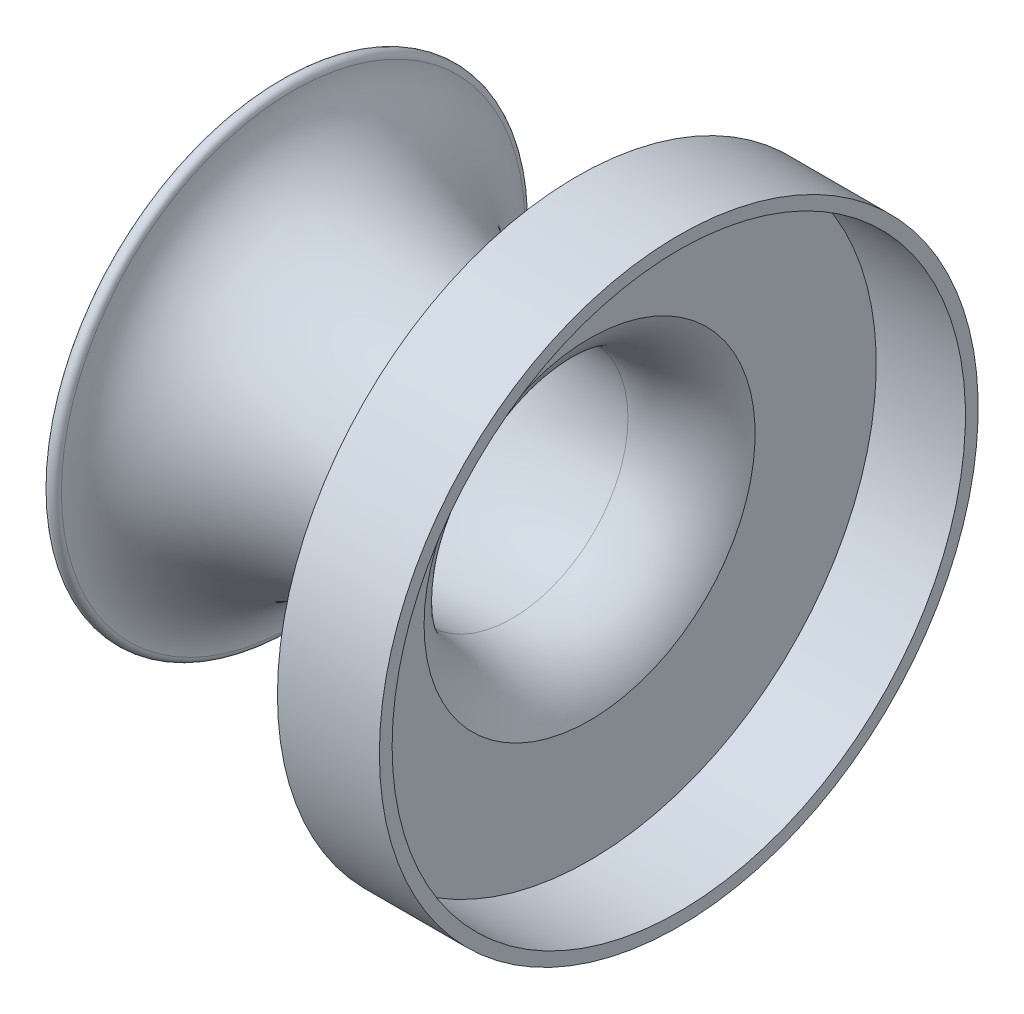
ISO-10303-21;
HEADER;
FILE_DESCRIPTION(('STEP AP214'),'2;1');
FILE_NAME('part.step','',(''),(''),'','','');
FILE_SCHEMA(('AUTOMOTIVE_DESIGN { 1 0 10303 214 1 1 1 1 }'));
ENDSEC;
DATA;
#1=APPLICATION_CONTEXT('core data for automotive mechanical design processes');
#2=APPLICATION_PROTOCOL_DEFINITION('international standard','automotive_design',2000,#1);
#3=PRODUCT_CONTEXT('',#1,'mechanical');
#4=PRODUCT('Part','Part','',(#3));
#5=PRODUCT_RELATED_PRODUCT_CATEGORY('part','',(#4));
#6=PRODUCT_DEFINITION_FORMATION('','',#4);
#7=PRODUCT_DEFINITION_CONTEXT('part definition',#1,'design');
#8=PRODUCT_DEFINITION('design','',#6,#7);
#9=PRODUCT_DEFINITION_SHAPE('','',#8);
#10=(LENGTH_UNIT() NAMED_UNIT(*) SI_UNIT(.MILLI.,.METRE.));
#11=(NAMED_UNIT(*) PLANE_ANGLE_UNIT() SI_UNIT($,.RADIAN.));
#12=(NAMED_UNIT(*) SI_UNIT($,.STERADIAN.) SOLID_ANGLE_UNIT());
#13=UNCERTAINTY_MEASURE_WITH_UNIT(LENGTH_MEASURE(1.E-05),#10,'distance_accuracy_value','');
#14=(GEOMETRIC_REPRESENTATION_CONTEXT(3) GLOBAL_UNCERTAINTY_ASSIGNED_CONTEXT((#13)) GLOBAL_UNIT_ASSIGNED_CONTEXT((#10,
#11,#12)) REPRESENTATION_CONTEXT('',''));
#15=CARTESIAN_POINT('',(0.,0.,0.));
#16=DIRECTION('',(0.,0.,1.));
#17=DIRECTION('',(1.,0.,0.));
#18=AXIS2_PLACEMENT_3D('',#15,#16,#17);
#19=CARTESIAN_POINT('',(0.,46.20006,0.));
#20=DIRECTION('',(0.,0.,1.));
#21=DIRECTION('',(1.,0.,0.));
#22=AXIS2_PLACEMENT_3D('',#19,#20,#21);
#23=ELLIPSE('',#22,46.20006,23.10003);
#24=CARTESIAN_POINT('',(0.,0.,0.));
#25=DIRECTION('',(-1.,0.,0.));
#26=AXIS1_PLACEMENT('',#24,#25);
#27=SURFACE_OF_REVOLUTION('',#23,#26);
#28=CARTESIAN_POINT('',(0.,0.,0.));
#29=DIRECTION('',(-1.,0.,0.));
#30=DIRECTION('',(0.,0.,1.));
#31=AXIS2_PLACEMENT_3D('',#28,#29,#30);
#32=CIRCLE('',#31,23.10003);
#33=CARTESIAN_POINT('',(0.,0.,23.10003));
#34=VERTEX_POINT('',#33);
#35=EDGE_CURVE('E10',#34,#34,#32,.T.);
#36=ORIENTED_EDGE('',*,*,#35,.F.);
#37=EDGE_LOOP('',(#36));
#38=FACE_BOUND('',#37,.T.);
#39=CARTESIAN_POINT('',(-46.20006,0.,0.));
#40=DIRECTION('',(-1.,0.,0.));
#41=DIRECTION('',(0.,0.,1.));
#42=AXIS2_PLACEMENT_3D('',#39,#40,#41);
#43=CIRCLE('',#42,46.20006);
#44=CARTESIAN_POINT('',(-46.20006,0.,46.20006));
#45=VERTEX_POINT('',#44);
#46=EDGE_CURVE('E84',#45,#45,#43,.T.);
#47=ORIENTED_EDGE('',*,*,#46,.T.);
#48=EDGE_LOOP('',(#47));
#49=FACE_BOUND('',#48,.T.);
#50=ADVANCED_FACE('F40',(#38,#49),#27,.T.);
#51=CARTESIAN_POINT('',(0.,0.,0.));
#52=DIRECTION('',(-1.,0.,0.));
#53=DIRECTION('',(0.,0.,1.));
#54=AXIS2_PLACEMENT_3D('',#51,#52,#53);
#55=TOROIDAL_SURFACE('',#54,40.099996,16.999966);
#56=CARTESIAN_POINT('',(15.4463512518954,0.,0.));
#57=DIRECTION('',(-1.,0.,0.));
#58=DIRECTION('',(0.,0.,1.));
#59=AXIS2_PLACEMENT_3D('',#56,#57,#58);
#60=CIRCLE('',#59,33.000061);
#61=CARTESIAN_POINT('',(15.4463512518954,0.,33.000061));
#62=VERTEX_POINT('',#61);
#63=EDGE_CURVE('E48',#62,#62,#60,.T.);
#64=ORIENTED_EDGE('',*,*,#63,.F.);
#65=EDGE_LOOP('',(#64));
#66=FACE_BOUND('',#65,.T.);
#67=ORIENTED_EDGE('',*,*,#35,.T.);
#68=EDGE_LOOP('',(#67));
#69=FACE_BOUND('',#68,.T.);
#70=ADVANCED_FACE('F124',(#66,#69),#55,.T.);
#71=CARTESIAN_POINT('',(15.4463512518954,33.000061,0.));
#72=DIRECTION('',(-1.,0.,0.));
#73=DIRECTION('',(0.,0.,1.));
#74=AXIS2_PLACEMENT_3D('',#71,#72,#73);
#75=PLANE('',#74);
#76=CARTESIAN_POINT('',(15.4463512518954,0.,0.));
#77=DIRECTION('',(-1.,0.,0.));
#78=DIRECTION('',(0.,0.,1.));
#79=AXIS2_PLACEMENT_3D('',#76,#77,#78);
#80=CIRCLE('',#79,57.15);
#81=CARTESIAN_POINT('',(15.4463512518954,0.,57.15));
#82=VERTEX_POINT('',#81);
#83=EDGE_CURVE('E53',#82,#82,#80,.T.);
#84=ORIENTED_EDGE('',*,*,#83,.F.);
#85=EDGE_LOOP('',(#84));
#86=FACE_BOUND('',#85,.T.);
#87=ORIENTED_EDGE('',*,*,#63,.T.);
#88=EDGE_LOOP('',(#87));
#89=FACE_BOUND('',#88,.T.);
#90=ADVANCED_FACE('F121',(#86,#89),#75,.F.);
#91=CARTESIAN_POINT('',(0.,0.,0.));
#92=DIRECTION('',(-1.,0.,0.));
#93=DIRECTION('',(0.,0.,1.));
#94=AXIS2_PLACEMENT_3D('',#91,#92,#93);
#95=CYLINDRICAL_SURFACE('',#94,57.15);
#96=CARTESIAN_POINT('',(33.2263512518954,0.,0.));
#97=DIRECTION('',(-1.,0.,0.));
#98=DIRECTION('',(0.,0.,1.));
#99=AXIS2_PLACEMENT_3D('',#96,#97,#98);
#100=CIRCLE('',#99,57.15);
#101=CARTESIAN_POINT('',(33.2263512518954,0.,57.15));
#102=VERTEX_POINT('',#101);
#103=EDGE_CURVE('E58',#102,#102,#100,.T.);
#104=ORIENTED_EDGE('',*,*,#103,.F.);
#105=EDGE_LOOP('',(#104));
#106=FACE_BOUND('',#105,.T.);
#107=ORIENTED_EDGE('',*,*,#83,.T.);
#108=EDGE_LOOP('',(#107));
#109=FACE_BOUND('',#108,.T.);
#110=ADVANCED_FACE('F117',(#106,#109),#95,.F.);
#111=CARTESIAN_POINT('',(33.2263512518954,59.69,0.));
#112=DIRECTION('',(-1.,0.,0.));
#113=DIRECTION('',(0.,0.,1.));
#114=AXIS2_PLACEMENT_3D('',#111,#112,#113);
#115=PLANE('',#114);
#116=CARTESIAN_POINT('',(33.2263512518954,0.,0.));
#117=DIRECTION('',(-1.,0.,0.));
#118=DIRECTION('',(0.,0.,1.));
#119=AXIS2_PLACEMENT_3D('',#116,#117,#118);
#120=CIRCLE('',#119,59.69);
#121=CARTESIAN_POINT('',(33.2263512518954,0.,59.69));
#122=VERTEX_POINT('',#121);
#123=EDGE_CURVE('E64',#122,#122,#120,.T.);
#124=ORIENTED_EDGE('',*,*,#123,.F.);
#125=EDGE_LOOP('',(#124));
#126=FACE_BOUND('',#125,.T.);
#127=ORIENTED_EDGE('',*,*,#103,.T.);
#128=EDGE_LOOP('',(#127));
#129=FACE_BOUND('',#128,.T.);
#130=ADVANCED_FACE('F113',(#126,#129),#115,.F.);
#131=CARTESIAN_POINT('',(0.,0.,0.));
#132=DIRECTION('',(-1.,0.,0.));
#133=DIRECTION('',(0.,0.,1.));
#134=AXIS2_PLACEMENT_3D('',#131,#132,#133);
#135=CYLINDRICAL_SURFACE('',#134,59.69);
#136=CARTESIAN_POINT('',(12.9063512518954,0.,0.));
#137=DIRECTION('',(-1.,0.,0.));
#138=DIRECTION('',(0.,0.,1.));
#139=AXIS2_PLACEMENT_3D('',#136,#137,#138);
#140=CIRCLE('',#139,59.69);
#141=CARTESIAN_POINT('',(12.9063512518954,0.,59.69));
#142=VERTEX_POINT('',#141);
#143=EDGE_CURVE('E68',#142,#142,#140,.T.);
#144=ORIENTED_EDGE('',*,*,#143,.F.);
#145=EDGE_LOOP('',(#144));
#146=FACE_BOUND('',#145,.T.);
#147=ORIENTED_EDGE('',*,*,#123,.T.);
#148=EDGE_LOOP('',(#147));
#149=FACE_BOUND('',#148,.T.);
#150=ADVANCED_FACE('F109',(#146,#149),#135,.T.);
#151=CARTESIAN_POINT('',(12.9063512518954,33.5795118090941,0.));
#152=DIRECTION('',(1.,0.,0.));
#153=DIRECTION('',(0.,0.,-1.));
#154=AXIS2_PLACEMENT_3D('',#151,#152,#153);
#155=PLANE('',#154);
#156=CARTESIAN_POINT('',(12.9063512518954,0.,0.));
#157=DIRECTION('',(-1.,0.,0.));
#158=DIRECTION('',(0.,0.,1.));
#159=AXIS2_PLACEMENT_3D('',#156,#157,#158);
#160=CIRCLE('',#159,33.5795118090941);
#161=CARTESIAN_POINT('',(12.9063512518954,0.,33.5795118090941));
#162=VERTEX_POINT('',#161);
#163=EDGE_CURVE('E72',#162,#162,#160,.T.);
#164=ORIENTED_EDGE('',*,*,#163,.F.);
#165=EDGE_LOOP('',(#164));
#166=FACE_BOUND('',#165,.T.);
#167=ORIENTED_EDGE('',*,*,#143,.T.);
#168=EDGE_LOOP('',(#167));
#169=FACE_BOUND('',#168,.T.);
#170=ADVANCED_FACE('F105',(#166,#169),#155,.F.);
#171=CARTESIAN_POINT('',(0.,0.,0.));
#172=DIRECTION('',(-1.,0.,0.));
#173=DIRECTION('',(0.,0.,1.));
#174=AXIS2_PLACEMENT_3D('',#171,#172,#173);
#175=TOROIDAL_SURFACE('',#174,40.099996,14.459966);
#176=CARTESIAN_POINT('',(0.,0.,0.));
#177=DIRECTION('',(-1.,0.,0.));
#178=DIRECTION('',(0.,0.,1.));
#179=AXIS2_PLACEMENT_3D('',#176,#177,#178);
#180=CIRCLE('',#179,25.64003);
#181=CARTESIAN_POINT('',(0.,0.,25.64003));
#182=VERTEX_POINT('',#181);
#183=EDGE_CURVE('E76',#182,#182,#180,.T.);
#184=ORIENTED_EDGE('',*,*,#183,.F.);
#185=EDGE_LOOP('',(#184));
#186=FACE_BOUND('',#185,.T.);
#187=ORIENTED_EDGE('',*,*,#163,.T.);
#188=EDGE_LOOP('',(#187));
#189=FACE_BOUND('',#188,.T.);
#190=ADVANCED_FACE('F101',(#186,#189),#175,.F.);
#191=CARTESIAN_POINT('',(0.,25.64003,0.));
#192=CARTESIAN_POINT('',(-2.92413983029055,25.64003,0.));
#193=CARTESIAN_POINT('',(-8.82958883964443,25.929831173758,0.));
#194=CARTESIAN_POINT('',(-17.2810657718078,27.2140706088949,0.));
#195=CARTESIAN_POINT('',(-25.0354154132788,29.2876829208647,0.));
#196=CARTESIAN_POINT('',(-31.7523963761466,32.0483716425984,0.));
#197=CARTESIAN_POINT('',(-37.1497181900675,35.3451337479046,0.));
#198=CARTESIAN_POINT('',(-41.0016653272154,38.9712517645608,0.));
#199=CARTESIAN_POINT('',(-42.8397766775138,42.0390541688929,0.));
#200=CARTESIAN_POINT('',(-43.5447945282441,44.4325700755908,0.));
#201=CARTESIAN_POINT('',(-43.66006,45.6061038175789,0.));
#202=CARTESIAN_POINT('',(-43.66006,46.20006,0.));
#203=B_SPLINE_CURVE_WITH_KNOTS('',3,(#191,#192,#193,#194,#195,#196,#197,#198,#199,#200,#201,
#202),.UNSPECIFIED.,.F.,.F.,(4,1,1,1,1,1,1,1,1,4),(3.14159265358979,3.33794219443916,
3.53429173528852,3.73064127613788,3.92699081698724,4.1233403578366,4.31968989868597,
4.51603943953533,4.61421420996001,4.71238898038469),.UNSPECIFIED.);
#204=CARTESIAN_POINT('',(0.,0.,0.));
#205=DIRECTION('',(-1.,0.,0.));
#206=AXIS1_PLACEMENT('',#204,#205);
#207=SURFACE_OF_REVOLUTION('',#203,#206);
#208=CARTESIAN_POINT('',(-43.66006,0.,0.));
#209=DIRECTION('',(-1.,0.,0.));
#210=DIRECTION('',(0.,0.,1.));
#211=AXIS2_PLACEMENT_3D('',#208,#209,#210);
#212=CIRCLE('',#211,46.20006);
#213=CARTESIAN_POINT('',(-43.66006,0.,46.20006));
#214=VERTEX_POINT('',#213);
#215=EDGE_CURVE('E80',#214,#214,#212,.T.);
#216=ORIENTED_EDGE('',*,*,#215,.F.);
#217=EDGE_LOOP('',(#216));
#218=FACE_BOUND('',#217,.T.);
#219=ORIENTED_EDGE('',*,*,#183,.T.);
#220=EDGE_LOOP('',(#219));
#221=FACE_BOUND('',#220,.T.);
#222=ADVANCED_FACE('F96',(#218,#221),#207,.T.);
#223=CARTESIAN_POINT('',(-44.93006,0.,0.));
#224=DIRECTION('',(-1.,0.,0.));
#225=DIRECTION('',(0.,0.,1.));
#226=AXIS2_PLACEMENT_3D('',#223,#224,#225);
#227=TOROIDAL_SURFACE('',#226,46.20006,1.27);
#228=ORIENTED_EDGE('',*,*,#46,.F.);
#229=EDGE_LOOP('',(#228));
#230=FACE_BOUND('',#229,.T.);
#231=ORIENTED_EDGE('',*,*,#215,.T.);
#232=EDGE_LOOP('',(#231));
#233=FACE_BOUND('',#232,.T.);
#234=ADVANCED_FACE('F100',(#230,#233),#227,.T.);
#235=CLOSED_SHELL('',(#50,#70,#90,#110,#130,#150,#170,#190,#222,#234));
#236=MANIFOLD_SOLID_BREP('B2',#235);
#237=ADVANCED_BREP_SHAPE_REPRESENTATION('',(#18,#236),#14);
#238=SHAPE_DEFINITION_REPRESENTATION(#9,#237);
ENDSEC;
END-ISO-10303-21;
